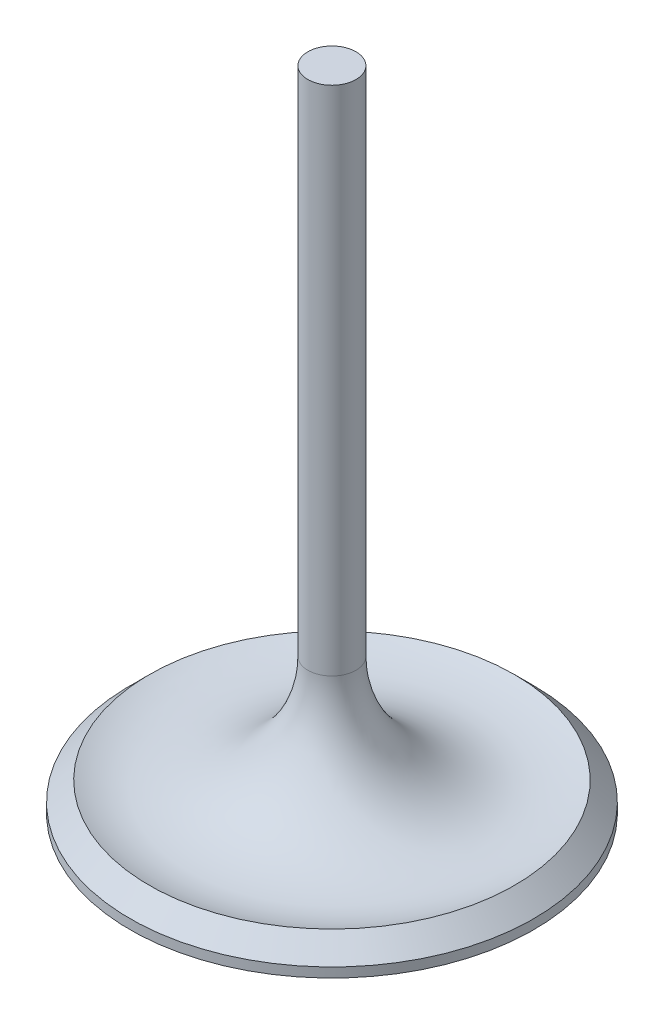
ISO-10303-21;
HEADER;
FILE_DESCRIPTION(('STEP AP214'),'2;1');
FILE_NAME('part.step','',(''),(''),'','','');
FILE_SCHEMA(('AUTOMOTIVE_DESIGN { 1 0 10303 214 1 1 1 1 }'));
ENDSEC;
DATA;
#1=APPLICATION_CONTEXT('core data for automotive mechanical design processes');
#2=APPLICATION_PROTOCOL_DEFINITION('international standard','automotive_design',2000,#1);
#3=PRODUCT_CONTEXT('',#1,'mechanical');
#4=PRODUCT('Part','Part','',(#3));
#5=PRODUCT_RELATED_PRODUCT_CATEGORY('part','',(#4));
#6=PRODUCT_DEFINITION_FORMATION('','',#4);
#7=PRODUCT_DEFINITION_CONTEXT('part definition',#1,'design');
#8=PRODUCT_DEFINITION('design','',#6,#7);
#9=PRODUCT_DEFINITION_SHAPE('','',#8);
#10=(LENGTH_UNIT() NAMED_UNIT(*) SI_UNIT(.MILLI.,.METRE.));
#11=(NAMED_UNIT(*) PLANE_ANGLE_UNIT() SI_UNIT($,.RADIAN.));
#12=(NAMED_UNIT(*) SI_UNIT($,.STERADIAN.) SOLID_ANGLE_UNIT());
#13=UNCERTAINTY_MEASURE_WITH_UNIT(LENGTH_MEASURE(1.E-05),#10,'distance_accuracy_value','');
#14=(GEOMETRIC_REPRESENTATION_CONTEXT(3) GLOBAL_UNCERTAINTY_ASSIGNED_CONTEXT((#13)) GLOBAL_UNIT_ASSIGNED_CONTEXT((#10,
#11,#12)) REPRESENTATION_CONTEXT('',''));
#15=CARTESIAN_POINT('',(0.,0.,0.));
#16=DIRECTION('',(0.,0.,1.));
#17=DIRECTION('',(1.,0.,0.));
#18=AXIS2_PLACEMENT_3D('',#15,#16,#17);
#19=CARTESIAN_POINT('',(0.,0.,0.));
#20=DIRECTION('',(0.,-1.,0.));
#21=DIRECTION('',(0.,0.,-1.));
#22=AXIS2_PLACEMENT_3D('',#19,#20,#21);
#23=PLANE('',#22);
#24=CARTESIAN_POINT('',(0.,0.,0.));
#25=DIRECTION('',(0.,-1.,0.));
#26=DIRECTION('',(0.,0.,-1.));
#27=AXIS2_PLACEMENT_3D('',#24,#25,#26);
#28=CIRCLE('',#27,26.67);
#29=CARTESIAN_POINT('',(0.,0.,-26.67));
#30=VERTEX_POINT('',#29);
#31=EDGE_CURVE('E10',#30,#30,#28,.T.);
#32=ORIENTED_EDGE('',*,*,#31,.T.);
#33=EDGE_LOOP('',(#32));
#34=FACE_BOUND('',#33,.T.);
#35=ADVANCED_FACE('F37',(#34),#23,.T.);
#36=CARTESIAN_POINT('',(0.,0.,0.));
#37=DIRECTION('',(0.,-1.,0.));
#38=DIRECTION('',(0.,0.,-1.));
#39=AXIS2_PLACEMENT_3D('',#36,#37,#38);
#40=CYLINDRICAL_SURFACE('',#39,26.67);
#41=CARTESIAN_POINT('',(0.,1.27,0.));
#42=DIRECTION('',(0.,-1.,0.));
#43=DIRECTION('',(0.,0.,-1.));
#44=AXIS2_PLACEMENT_3D('',#41,#42,#43);
#45=CIRCLE('',#44,26.67);
#46=CARTESIAN_POINT('',(0.,1.27,-26.67));
#47=VERTEX_POINT('',#46);
#48=EDGE_CURVE('E44',#47,#47,#45,.T.);
#49=ORIENTED_EDGE('',*,*,#48,.T.);
#50=EDGE_LOOP('',(#49));
#51=FACE_BOUND('',#50,.T.);
#52=ORIENTED_EDGE('',*,*,#31,.F.);
#53=EDGE_LOOP('',(#52));
#54=FACE_BOUND('',#53,.T.);
#55=ADVANCED_FACE('F77',(#51,#54),#40,.T.);
#56=CARTESIAN_POINT('',(0.,1.27,0.));
#57=DIRECTION('',(0.,-1.,0.));
#58=DIRECTION('',(0.,0.,-1.));
#59=AXIS2_PLACEMENT_3D('',#56,#57,#58);
#60=CONICAL_SURFACE('',#59,26.67,0.785398163397455);
#61=CARTESIAN_POINT('',(0.,3.81,0.));
#62=DIRECTION('',(0.,-1.,0.));
#63=DIRECTION('',(0.,0.,-1.));
#64=AXIS2_PLACEMENT_3D('',#61,#62,#63);
#65=CIRCLE('',#64,24.13);
#66=CARTESIAN_POINT('',(0.,3.81,-24.13));
#67=VERTEX_POINT('',#66);
#68=EDGE_CURVE('E49',#67,#67,#65,.T.);
#69=ORIENTED_EDGE('',*,*,#68,.T.);
#70=EDGE_LOOP('',(#69));
#71=FACE_BOUND('',#70,.T.);
#72=ORIENTED_EDGE('',*,*,#48,.F.);
#73=EDGE_LOOP('',(#72));
#74=FACE_BOUND('',#73,.T.);
#75=ADVANCED_FACE('F81',(#71,#74),#60,.T.);
#76=CARTESIAN_POINT('',(0.,17.9546986535592,0.));
#77=DIRECTION('',(0.,-1.,0.));
#78=DIRECTION('',(0.,0.,-1.));
#79=AXIS2_PLACEMENT_3D('',#76,#77,#78);
#80=TOROIDAL_SURFACE('',#79,18.43,15.25);
#81=CARTESIAN_POINT('',(0.,17.9546986535592,0.));
#82=DIRECTION('',(0.,-1.,0.));
#83=DIRECTION('',(0.,0.,-1.));
#84=AXIS2_PLACEMENT_3D('',#81,#82,#83);
#85=CIRCLE('',#84,3.18000000000001);
#86=CARTESIAN_POINT('',(0.,17.9546986535592,-3.18000000000001));
#87=VERTEX_POINT('',#86);
#88=EDGE_CURVE('E54',#87,#87,#85,.T.);
#89=ORIENTED_EDGE('',*,*,#88,.T.);
#90=EDGE_LOOP('',(#89));
#91=FACE_BOUND('',#90,.T.);
#92=ORIENTED_EDGE('',*,*,#68,.F.);
#93=EDGE_LOOP('',(#92));
#94=FACE_BOUND('',#93,.T.);
#95=ADVANCED_FACE('F74',(#91,#94),#80,.F.);
#96=CARTESIAN_POINT('',(0.,0.,0.));
#97=DIRECTION('',(0.,-1.,0.));
#98=DIRECTION('',(0.,0.,-1.));
#99=AXIS2_PLACEMENT_3D('',#96,#97,#98);
#100=CYLINDRICAL_SURFACE('',#99,3.18000000000001);
#101=CARTESIAN_POINT('',(0.,85.55,0.));
#102=DIRECTION('',(0.,-1.,0.));
#103=DIRECTION('',(0.,0.,-1.));
#104=AXIS2_PLACEMENT_3D('',#101,#102,#103);
#105=CIRCLE('',#104,3.18);
#106=CARTESIAN_POINT('',(0.,85.55,-3.18));
#107=VERTEX_POINT('',#106);
#108=EDGE_CURVE('E60',#107,#107,#105,.T.);
#109=ORIENTED_EDGE('',*,*,#108,.T.);
#110=EDGE_LOOP('',(#109));
#111=FACE_BOUND('',#110,.T.);
#112=ORIENTED_EDGE('',*,*,#88,.F.);
#113=EDGE_LOOP('',(#112));
#114=FACE_BOUND('',#113,.T.);
#115=ADVANCED_FACE('F65',(#111,#114),#100,.T.);
#116=CARTESIAN_POINT('',(0.,85.55,0.));
#117=DIRECTION('',(0.,1.,0.));
#118=DIRECTION('',(0.,0.,1.));
#119=AXIS2_PLACEMENT_3D('',#116,#117,#118);
#120=PLANE('',#119);
#121=ORIENTED_EDGE('',*,*,#108,.F.);
#122=EDGE_LOOP('',(#121));
#123=FACE_BOUND('',#122,.T.);
#124=ADVANCED_FACE('F68',(#123),#120,.T.);
#125=CLOSED_SHELL('',(#35,#55,#75,#95,#115,#124));
#126=MANIFOLD_SOLID_BREP('B2',#125);
#127=ADVANCED_BREP_SHAPE_REPRESENTATION('',(#18,#126),#14);
#128=SHAPE_DEFINITION_REPRESENTATION(#9,#127);
ENDSEC;
END-ISO-10303-21;
